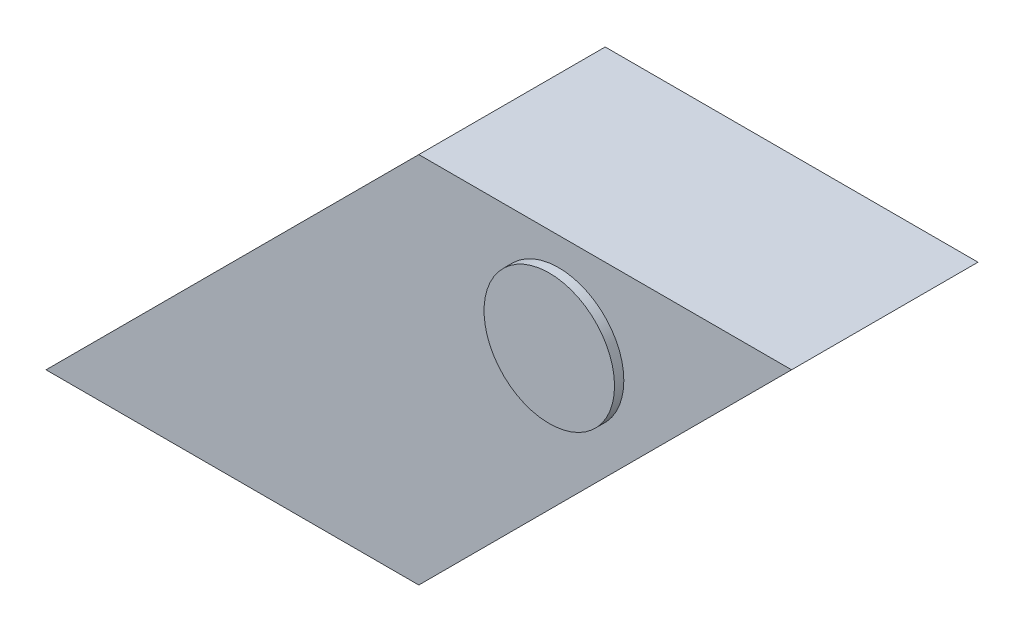
ISO-10303-21;
HEADER;
FILE_DESCRIPTION(('STEP AP214'),'2;1');
FILE_NAME('part.step','',(''),(''),'','','');
FILE_SCHEMA(('AUTOMOTIVE_DESIGN { 1 0 10303 214 1 1 1 1 }'));
ENDSEC;
DATA;
#1=APPLICATION_CONTEXT('core data for automotive mechanical design processes');
#2=APPLICATION_PROTOCOL_DEFINITION('international standard','automotive_design',2000,#1);
#3=PRODUCT_CONTEXT('',#1,'mechanical');
#4=PRODUCT('Part','Part','',(#3));
#5=PRODUCT_RELATED_PRODUCT_CATEGORY('part','',(#4));
#6=PRODUCT_DEFINITION_FORMATION('','',#4);
#7=PRODUCT_DEFINITION_CONTEXT('part definition',#1,'design');
#8=PRODUCT_DEFINITION('design','',#6,#7);
#9=PRODUCT_DEFINITION_SHAPE('','',#8);
#10=(LENGTH_UNIT() NAMED_UNIT(*) SI_UNIT(.MILLI.,.METRE.));
#11=(NAMED_UNIT(*) PLANE_ANGLE_UNIT() SI_UNIT($,.RADIAN.));
#12=(NAMED_UNIT(*) SI_UNIT($,.STERADIAN.) SOLID_ANGLE_UNIT());
#13=UNCERTAINTY_MEASURE_WITH_UNIT(LENGTH_MEASURE(1.E-05),#10,'distance_accuracy_value','');
#14=(GEOMETRIC_REPRESENTATION_CONTEXT(3) GLOBAL_UNCERTAINTY_ASSIGNED_CONTEXT((#13)) GLOBAL_UNIT_ASSIGNED_CONTEXT((#10,
#11,#12)) REPRESENTATION_CONTEXT('',''));
#15=CARTESIAN_POINT('',(0.,0.,0.));
#16=DIRECTION('',(0.,0.,1.));
#17=DIRECTION('',(1.,0.,0.));
#18=AXIS2_PLACEMENT_3D('',#15,#16,#17);
#19=CARTESIAN_POINT('',(0.,0.,200.));
#20=DIRECTION('',(0.,1.,0.));
#21=DIRECTION('',(0.,0.,1.));
#22=AXIS2_PLACEMENT_3D('',#19,#20,#21);
#23=PLANE('',#22);
#24=CARTESIAN_POINT('',(200.,0.,100.));
#25=DIRECTION('',(0.,-1.,0.));
#26=DIRECTION('',(0.,0.,-1.));
#27=AXIS2_PLACEMENT_3D('',#24,#25,#26);
#28=CIRCLE('',#27,50.);
#29=CARTESIAN_POINT('',(200.,0.,50.));
#30=VERTEX_POINT('',#29);
#31=EDGE_CURVE('E124',#30,#30,#28,.T.);
#32=ORIENTED_EDGE('',*,*,#31,.F.);
#33=EDGE_LOOP('',(#32));
#34=FACE_BOUND('',#33,.T.);
#35=DIRECTION('',(1.,0.,0.));
#36=VECTOR('',#35,1.);
#37=CARTESIAN_POINT('',(0.,0.,0.));
#38=LINE('',#37,#36);
#39=CARTESIAN_POINT('',(0.,0.,0.));
#40=VERTEX_POINT('',#39);
#41=CARTESIAN_POINT('',(400.,0.,0.));
#42=VERTEX_POINT('',#41);
#43=EDGE_CURVE('E104',#40,#42,#38,.T.);
#44=ORIENTED_EDGE('',*,*,#43,.T.);
#45=DIRECTION('',(0.,0.,-1.));
#46=VECTOR('',#45,1.);
#47=CARTESIAN_POINT('',(400.,0.,200.));
#48=LINE('',#47,#46);
#49=CARTESIAN_POINT('',(400.,0.,200.));
#50=VERTEX_POINT('',#49);
#51=EDGE_CURVE('E45',#50,#42,#48,.T.);
#52=ORIENTED_EDGE('',*,*,#51,.F.);
#53=DIRECTION('',(1.,0.,0.));
#54=VECTOR('',#53,1.);
#55=CARTESIAN_POINT('',(0.,0.,200.));
#56=LINE('',#55,#54);
#57=CARTESIAN_POINT('',(0.,0.,200.));
#58=VERTEX_POINT('',#57);
#59=EDGE_CURVE('E95',#58,#50,#56,.T.);
#60=ORIENTED_EDGE('',*,*,#59,.F.);
#61=DIRECTION('',(0.,0.,-1.));
#62=VECTOR('',#61,1.);
#63=CARTESIAN_POINT('',(0.,0.,200.));
#64=LINE('',#63,#62);
#65=EDGE_CURVE('E101',#58,#40,#64,.T.);
#66=ORIENTED_EDGE('',*,*,#65,.T.);
#67=EDGE_LOOP('',(#44,#52,#60,#66));
#68=FACE_BOUND('',#67,.T.);
#69=ADVANCED_FACE('F39',(#34,#68),#23,.F.);
#70=CARTESIAN_POINT('',(400.,0.,200.));
#71=DIRECTION('',(-0.707106781186549,0.707106781186546,0.));
#72=DIRECTION('',(-0.707106781186546,-0.707106781186549,0.));
#73=AXIS2_PLACEMENT_3D('',#70,#71,#72);
#74=PLANE('',#73);
#75=DIRECTION('',(0.707106781186546,0.707106781186549,0.));
#76=VECTOR('',#75,1.);
#77=CARTESIAN_POINT('',(400.,0.,0.));
#78=LINE('',#77,#76);
#79=CARTESIAN_POINT('',(800.,400.000000000002,0.));
#80=VERTEX_POINT('',#79);
#81=EDGE_CURVE('E100',#42,#80,#78,.T.);
#82=ORIENTED_EDGE('',*,*,#81,.T.);
#83=DIRECTION('',(0.,0.,-1.));
#84=VECTOR('',#83,1.);
#85=CARTESIAN_POINT('',(800.,400.000000000002,200.));
#86=LINE('',#85,#84);
#87=CARTESIAN_POINT('',(800.,400.000000000002,200.));
#88=VERTEX_POINT('',#87);
#89=EDGE_CURVE('E92',#88,#80,#86,.T.);
#90=ORIENTED_EDGE('',*,*,#89,.F.);
#91=DIRECTION('',(0.707106781186546,0.707106781186549,0.));
#92=VECTOR('',#91,1.);
#93=CARTESIAN_POINT('',(400.,0.,200.));
#94=LINE('',#93,#92);
#95=EDGE_CURVE('E87',#50,#88,#94,.T.);
#96=ORIENTED_EDGE('',*,*,#95,.F.);
#97=ORIENTED_EDGE('',*,*,#51,.T.);
#98=EDGE_LOOP('',(#82,#90,#96,#97));
#99=FACE_BOUND('',#98,.T.);
#100=ADVANCED_FACE('F96',(#99),#74,.F.);
#101=CARTESIAN_POINT('',(400.,400.000000000002,200.));
#102=DIRECTION('',(0.,-1.,0.));
#103=DIRECTION('',(1.,0.,0.));
#104=AXIS2_PLACEMENT_3D('',#101,#102,#103);
#105=PLANE('',#104);
#106=DIRECTION('',(-1.,0.,0.));
#107=VECTOR('',#106,1.);
#108=CARTESIAN_POINT('',(400.,400.000000000002,0.));
#109=LINE('',#108,#107);
#110=CARTESIAN_POINT('',(400.,400.000000000002,0.));
#111=VERTEX_POINT('',#110);
#112=EDGE_CURVE('E71',#80,#111,#109,.T.);
#113=ORIENTED_EDGE('',*,*,#112,.T.);
#114=DIRECTION('',(0.,0.,-1.));
#115=VECTOR('',#114,1.);
#116=CARTESIAN_POINT('',(400.,400.000000000002,200.));
#117=LINE('',#116,#115);
#118=CARTESIAN_POINT('',(400.,400.000000000002,200.));
#119=VERTEX_POINT('',#118);
#120=EDGE_CURVE('E98',#119,#111,#117,.T.);
#121=ORIENTED_EDGE('',*,*,#120,.F.);
#122=DIRECTION('',(-1.,0.,0.));
#123=VECTOR('',#122,1.);
#124=CARTESIAN_POINT('',(400.,400.000000000002,200.));
#125=LINE('',#124,#123);
#126=EDGE_CURVE('E89',#88,#119,#125,.T.);
#127=ORIENTED_EDGE('',*,*,#126,.F.);
#128=ORIENTED_EDGE('',*,*,#89,.T.);
#129=EDGE_LOOP('',(#113,#121,#127,#128));
#130=FACE_BOUND('',#129,.T.);
#131=ADVANCED_FACE('F97',(#130),#105,.F.);
#132=CARTESIAN_POINT('',(0.,0.,200.));
#133=DIRECTION('',(0.707106781186549,-0.707106781186546,0.));
#134=DIRECTION('',(0.707106781186546,0.707106781186549,0.));
#135=AXIS2_PLACEMENT_3D('',#132,#133,#134);
#136=PLANE('',#135);
#137=DIRECTION('',(-0.707106781186546,-0.707106781186549,0.));
#138=VECTOR('',#137,1.);
#139=CARTESIAN_POINT('',(0.,0.,0.));
#140=LINE('',#139,#138);
#141=EDGE_CURVE('E76',#111,#40,#140,.T.);
#142=ORIENTED_EDGE('',*,*,#141,.T.);
#143=ORIENTED_EDGE('',*,*,#65,.F.);
#144=DIRECTION('',(-0.707106781186546,-0.707106781186549,0.));
#145=VECTOR('',#144,1.);
#146=CARTESIAN_POINT('',(0.,0.,200.));
#147=LINE('',#146,#145);
#148=EDGE_CURVE('E57',#119,#58,#147,.T.);
#149=ORIENTED_EDGE('',*,*,#148,.F.);
#150=ORIENTED_EDGE('',*,*,#120,.T.);
#151=EDGE_LOOP('',(#142,#143,#149,#150));
#152=FACE_BOUND('',#151,.T.);
#153=ADVANCED_FACE('F114',(#152),#136,.F.);
#154=CARTESIAN_POINT('',(0.,0.,200.));
#155=DIRECTION('',(0.,0.,1.));
#156=DIRECTION('',(1.,0.,0.));
#157=AXIS2_PLACEMENT_3D('',#154,#155,#156);
#158=PLANE('',#157);
#159=CARTESIAN_POINT('',(550.,300.000000000002,200.));
#160=DIRECTION('',(0.,0.,1.));
#161=DIRECTION('',(1.,0.,0.));
#162=AXIS2_PLACEMENT_3D('',#159,#160,#161);
#163=CIRCLE('',#162,70.);
#164=CARTESIAN_POINT('',(620.,300.000000000002,200.));
#165=VERTEX_POINT('',#164);
#166=EDGE_CURVE('E11',#165,#165,#163,.T.);
#167=ORIENTED_EDGE('',*,*,#166,.F.);
#168=EDGE_LOOP('',(#167));
#169=FACE_BOUND('',#168,.T.);
#170=ORIENTED_EDGE('',*,*,#59,.T.);
#171=ORIENTED_EDGE('',*,*,#95,.T.);
#172=ORIENTED_EDGE('',*,*,#126,.T.);
#173=ORIENTED_EDGE('',*,*,#148,.T.);
#174=EDGE_LOOP('',(#170,#171,#172,#173));
#175=FACE_BOUND('',#174,.T.);
#176=ADVANCED_FACE('F86',(#169,#175),#158,.T.);
#177=CARTESIAN_POINT('',(0.,0.,0.));
#178=DIRECTION('',(0.,0.,1.));
#179=DIRECTION('',(1.,0.,0.));
#180=AXIS2_PLACEMENT_3D('',#177,#178,#179);
#181=PLANE('',#180);
#182=ORIENTED_EDGE('',*,*,#43,.F.);
#183=ORIENTED_EDGE('',*,*,#141,.F.);
#184=ORIENTED_EDGE('',*,*,#112,.F.);
#185=ORIENTED_EDGE('',*,*,#81,.F.);
#186=EDGE_LOOP('',(#182,#183,#184,#185));
#187=FACE_BOUND('',#186,.T.);
#188=ADVANCED_FACE('F117',(#187),#181,.F.);
#189=CARTESIAN_POINT('',(550.,300.000000000002,210.));
#190=DIRECTION('',(0.,0.,-1.));
#191=DIRECTION('',(-1.,0.,0.));
#192=AXIS2_PLACEMENT_3D('',#189,#190,#191);
#193=CYLINDRICAL_SURFACE('',#192,70.);
#194=CARTESIAN_POINT('',(550.,300.000000000002,210.));
#195=DIRECTION('',(0.,0.,1.));
#196=DIRECTION('',(1.,0.,0.));
#197=AXIS2_PLACEMENT_3D('',#194,#195,#196);
#198=CIRCLE('',#197,70.);
#199=CARTESIAN_POINT('',(620.,300.000000000002,210.));
#200=VERTEX_POINT('',#199);
#201=EDGE_CURVE('E107',#200,#200,#198,.T.);
#202=ORIENTED_EDGE('',*,*,#201,.F.);
#203=EDGE_LOOP('',(#202));
#204=FACE_BOUND('',#203,.T.);
#205=ORIENTED_EDGE('',*,*,#166,.T.);
#206=EDGE_LOOP('',(#205));
#207=FACE_BOUND('',#206,.T.);
#208=ADVANCED_FACE('F151',(#204,#207),#193,.T.);
#209=CARTESIAN_POINT('',(550.,300.000000000002,210.));
#210=DIRECTION('',(0.,0.,1.));
#211=DIRECTION('',(1.,0.,0.));
#212=AXIS2_PLACEMENT_3D('',#209,#210,#211);
#213=PLANE('',#212);
#214=ORIENTED_EDGE('',*,*,#201,.T.);
#215=EDGE_LOOP('',(#214));
#216=FACE_BOUND('',#215,.T.);
#217=ADVANCED_FACE('F134',(#216),#213,.T.);
#218=CARTESIAN_POINT('',(200.,10.,100.));
#219=DIRECTION('',(0.,-1.,0.));
#220=DIRECTION('',(0.,0.,-1.));
#221=AXIS2_PLACEMENT_3D('',#218,#219,#220);
#222=CYLINDRICAL_SURFACE('',#221,50.);
#223=CARTESIAN_POINT('',(200.,10.,100.));
#224=DIRECTION('',(0.,-1.,0.));
#225=DIRECTION('',(0.,0.,-1.));
#226=AXIS2_PLACEMENT_3D('',#223,#224,#225);
#227=CIRCLE('',#226,50.);
#228=CARTESIAN_POINT('',(200.,10.,50.));
#229=VERTEX_POINT('',#228);
#230=EDGE_CURVE('E123',#229,#229,#227,.T.);
#231=ORIENTED_EDGE('',*,*,#230,.F.);
#232=EDGE_LOOP('',(#231));
#233=FACE_BOUND('',#232,.T.);
#234=ORIENTED_EDGE('',*,*,#31,.T.);
#235=EDGE_LOOP('',(#234));
#236=FACE_BOUND('',#235,.T.);
#237=ADVANCED_FACE('F128',(#233,#236),#222,.F.);
#238=CARTESIAN_POINT('',(200.,10.,100.));
#239=DIRECTION('',(0.,-1.,0.));
#240=DIRECTION('',(0.,0.,-1.));
#241=AXIS2_PLACEMENT_3D('',#238,#239,#240);
#242=PLANE('',#241);
#243=ORIENTED_EDGE('',*,*,#230,.T.);
#244=EDGE_LOOP('',(#243));
#245=FACE_BOUND('',#244,.T.);
#246=ADVANCED_FACE('F126',(#245),#242,.T.);
#247=CLOSED_SHELL('',(#69,#100,#131,#153,#176,#188,#208,#217,#237,#246));
#248=MANIFOLD_SOLID_BREP('B2',#247);
#249=ADVANCED_BREP_SHAPE_REPRESENTATION('',(#18,#248),#14);
#250=SHAPE_DEFINITION_REPRESENTATION(#9,#249);
ENDSEC;
END-ISO-10303-21;
